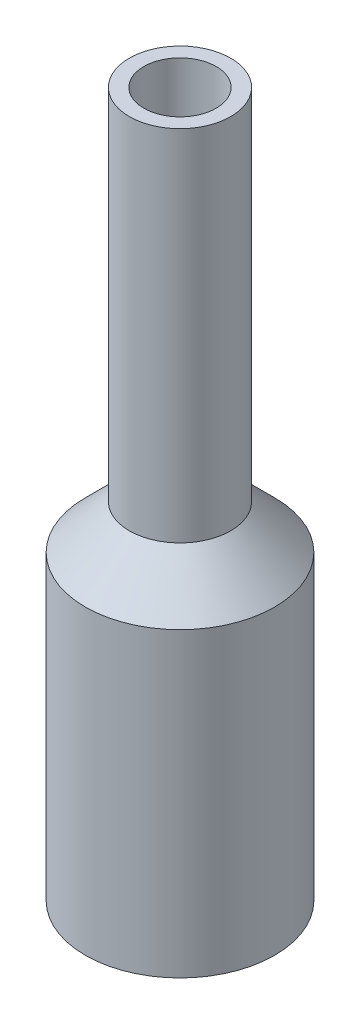
ISO-10303-21;
HEADER;
FILE_DESCRIPTION(('STEP AP214'),'2;1');
FILE_NAME('part.step','',(''),(''),'','','');
FILE_SCHEMA(('AUTOMOTIVE_DESIGN { 1 0 10303 214 1 1 1 1 }'));
ENDSEC;
DATA;
#1=APPLICATION_CONTEXT('core data for automotive mechanical design processes');
#2=APPLICATION_PROTOCOL_DEFINITION('international standard','automotive_design',2000,#1);
#3=PRODUCT_CONTEXT('',#1,'mechanical');
#4=PRODUCT('Part','Part','',(#3));
#5=PRODUCT_RELATED_PRODUCT_CATEGORY('part','',(#4));
#6=PRODUCT_DEFINITION_FORMATION('','',#4);
#7=PRODUCT_DEFINITION_CONTEXT('part definition',#1,'design');
#8=PRODUCT_DEFINITION('design','',#6,#7);
#9=PRODUCT_DEFINITION_SHAPE('','',#8);
#10=(LENGTH_UNIT() NAMED_UNIT(*) SI_UNIT(.MILLI.,.METRE.));
#11=(NAMED_UNIT(*) PLANE_ANGLE_UNIT() SI_UNIT($,.RADIAN.));
#12=(NAMED_UNIT(*) SI_UNIT($,.STERADIAN.) SOLID_ANGLE_UNIT());
#13=UNCERTAINTY_MEASURE_WITH_UNIT(LENGTH_MEASURE(1.E-05),#10,'distance_accuracy_value','');
#14=(GEOMETRIC_REPRESENTATION_CONTEXT(3) GLOBAL_UNCERTAINTY_ASSIGNED_CONTEXT((#13)) GLOBAL_UNIT_ASSIGNED_CONTEXT((#10,
#11,#12)) REPRESENTATION_CONTEXT('',''));
#15=CARTESIAN_POINT('',(0.,0.,0.));
#16=DIRECTION('',(0.,0.,1.));
#17=DIRECTION('',(1.,0.,0.));
#18=AXIS2_PLACEMENT_3D('',#15,#16,#17);
#19=CARTESIAN_POINT('',(0.,2.32867112922393,0.));
#20=DIRECTION('',(0.,-1.,0.));
#21=DIRECTION('',(0.,0.,-1.));
#22=AXIS2_PLACEMENT_3D('',#19,#20,#21);
#23=CONICAL_SURFACE('',#22,1.96196635979795,0.785398163397459);
#24=CARTESIAN_POINT('',(0.,3.24063748902186,0.));
#25=DIRECTION('',(0.,1.,0.));
#26=DIRECTION('',(0.,0.,1.));
#27=AXIS2_PLACEMENT_3D('',#24,#25,#26);
#28=CIRCLE('',#27,1.05);
#29=CARTESIAN_POINT('',(0.,3.24063748902186,1.05));
#30=VERTEX_POINT('',#29);
#31=EDGE_CURVE('E10',#30,#30,#28,.T.);
#32=ORIENTED_EDGE('',*,*,#31,.F.);
#33=EDGE_LOOP('',(#32));
#34=FACE_BOUND('',#33,.T.);
#35=CARTESIAN_POINT('',(0.,2.32867112922393,0.));
#36=DIRECTION('',(0.,1.,0.));
#37=DIRECTION('',(0.,0.,1.));
#38=AXIS2_PLACEMENT_3D('',#35,#36,#37);
#39=CIRCLE('',#38,1.96196635979795);
#40=CARTESIAN_POINT('',(0.,2.32867112922393,1.96196635979795));
#41=VERTEX_POINT('',#40);
#42=EDGE_CURVE('E50',#41,#41,#39,.T.);
#43=ORIENTED_EDGE('',*,*,#42,.T.);
#44=EDGE_LOOP('',(#43));
#45=FACE_BOUND('',#44,.T.);
#46=ADVANCED_FACE('F41',(#34,#45),#23,.T.);
#47=CARTESIAN_POINT('',(0.,19.7590062358836,0.));
#48=DIRECTION('',(0.,1.,0.));
#49=DIRECTION('',(0.,0.,1.));
#50=AXIS2_PLACEMENT_3D('',#47,#48,#49);
#51=CYLINDRICAL_SURFACE('',#50,1.96196635979794);
#52=ORIENTED_EDGE('',*,*,#42,.F.);
#53=EDGE_LOOP('',(#52));
#54=FACE_BOUND('',#53,.T.);
#55=CARTESIAN_POINT('',(0.,-3.9233921878481,0.));
#56=DIRECTION('',(0.,1.,0.));
#57=DIRECTION('',(0.,0.,1.));
#58=AXIS2_PLACEMENT_3D('',#55,#56,#57);
#59=CIRCLE('',#58,1.96196635979794);
#60=CARTESIAN_POINT('',(0.,-3.9233921878481,1.96196635979794));
#61=VERTEX_POINT('',#60);
#62=EDGE_CURVE('E51',#61,#61,#59,.T.);
#63=ORIENTED_EDGE('',*,*,#62,.T.);
#64=EDGE_LOOP('',(#63));
#65=FACE_BOUND('',#64,.T.);
#66=ADVANCED_FACE('F98',(#54,#65),#51,.T.);
#67=CARTESIAN_POINT('',(1.83814693078289,-3.92339218784809,0.));
#68=DIRECTION('',(0.,1.,0.));
#69=DIRECTION('',(0.,0.,1.));
#70=AXIS2_PLACEMENT_3D('',#67,#68,#69);
#71=PLANE('',#70);
#72=ORIENTED_EDGE('',*,*,#62,.F.);
#73=EDGE_LOOP('',(#72));
#74=FACE_BOUND('',#73,.T.);
#75=CARTESIAN_POINT('',(0.,-3.9233921878481,0.));
#76=DIRECTION('',(0.,1.,0.));
#77=DIRECTION('',(0.,0.,1.));
#78=AXIS2_PLACEMENT_3D('',#75,#76,#77);
#79=CIRCLE('',#78,1.83814693078289);
#80=CARTESIAN_POINT('',(0.,-3.9233921878481,1.83814693078289));
#81=VERTEX_POINT('',#80);
#82=EDGE_CURVE('E54',#81,#81,#79,.T.);
#83=ORIENTED_EDGE('',*,*,#82,.T.);
#84=EDGE_LOOP('',(#83));
#85=FACE_BOUND('',#84,.T.);
#86=ADVANCED_FACE('F103',(#74,#85),#71,.F.);
#87=CARTESIAN_POINT('',(0.,19.7590062358836,0.));
#88=DIRECTION('',(0.,1.,0.));
#89=DIRECTION('',(0.,0.,1.));
#90=AXIS2_PLACEMENT_3D('',#87,#88,#89);
#91=CYLINDRICAL_SURFACE('',#90,1.83814693078289);
#92=ORIENTED_EDGE('',*,*,#82,.F.);
#93=EDGE_LOOP('',(#92));
#94=FACE_BOUND('',#93,.T.);
#95=CARTESIAN_POINT('',(0.,2.32867112922393,0.));
#96=DIRECTION('',(0.,1.,0.));
#97=DIRECTION('',(0.,0.,1.));
#98=AXIS2_PLACEMENT_3D('',#95,#96,#97);
#99=CIRCLE('',#98,1.83814693078289);
#100=CARTESIAN_POINT('',(0.,2.32867112922393,1.83814693078289));
#101=VERTEX_POINT('',#100);
#102=EDGE_CURVE('E58',#101,#101,#99,.T.);
#103=ORIENTED_EDGE('',*,*,#102,.T.);
#104=EDGE_LOOP('',(#103));
#105=FACE_BOUND('',#104,.T.);
#106=ADVANCED_FACE('F107',(#94,#105),#91,.F.);
#107=CARTESIAN_POINT('',(0.,2.67660781215191,0.));
#108=DIRECTION('',(0.,-1.,0.));
#109=DIRECTION('',(0.,0.,-1.));
#110=AXIS2_PLACEMENT_3D('',#107,#108,#109);
#111=CONICAL_SURFACE('',#110,0.900000000000001,1.2156456408794);
#112=ORIENTED_EDGE('',*,*,#102,.F.);
#113=EDGE_LOOP('',(#112));
#114=FACE_BOUND('',#113,.T.);
#115=CARTESIAN_POINT('',(0.,2.67660781215191,0.));
#116=DIRECTION('',(0.,1.,0.));
#117=DIRECTION('',(0.,0.,1.));
#118=AXIS2_PLACEMENT_3D('',#115,#116,#117);
#119=CIRCLE('',#118,0.900000000000001);
#120=CARTESIAN_POINT('',(0.,2.67660781215191,0.900000000000001));
#121=VERTEX_POINT('',#120);
#122=EDGE_CURVE('E64',#121,#121,#119,.F.);
#123=ORIENTED_EDGE('',*,*,#122,.F.);
#124=EDGE_LOOP('',(#123));
#125=FACE_BOUND('',#124,.T.);
#126=ADVANCED_FACE('F94',(#114,#125),#111,.F.);
#127=CARTESIAN_POINT('',(0.750000000000001,2.67660781215191,0.));
#128=DIRECTION('',(0.,1.,0.));
#129=DIRECTION('',(0.,0.,1.));
#130=AXIS2_PLACEMENT_3D('',#127,#128,#129);
#131=PLANE('',#130);
#132=CARTESIAN_POINT('',(0.,2.67660781215191,0.));
#133=DIRECTION('',(0.,1.,0.));
#134=DIRECTION('',(0.,0.,1.));
#135=AXIS2_PLACEMENT_3D('',#132,#133,#134);
#136=CIRCLE('',#135,0.750000000000001);
#137=CARTESIAN_POINT('',(0.,2.67660781215191,0.750000000000001));
#138=VERTEX_POINT('',#137);
#139=EDGE_CURVE('E66',#138,#138,#136,.T.);
#140=ORIENTED_EDGE('',*,*,#139,.T.);
#141=EDGE_LOOP('',(#140));
#142=FACE_BOUND('',#141,.T.);
#143=ORIENTED_EDGE('',*,*,#122,.T.);
#144=EDGE_LOOP('',(#143));
#145=FACE_BOUND('',#144,.T.);
#146=ADVANCED_FACE('F88',(#142,#145),#131,.F.);
#147=CARTESIAN_POINT('',(0.,19.7590062358836,0.));
#148=DIRECTION('',(0.,1.,0.));
#149=DIRECTION('',(0.,0.,1.));
#150=AXIS2_PLACEMENT_3D('',#147,#148,#149);
#151=CYLINDRICAL_SURFACE('',#150,1.05);
#152=CARTESIAN_POINT('',(0.,10.6766078121519,0.));
#153=DIRECTION('',(0.,1.,0.));
#154=DIRECTION('',(0.,0.,1.));
#155=AXIS2_PLACEMENT_3D('',#152,#153,#154);
#156=CIRCLE('',#155,1.05);
#157=CARTESIAN_POINT('',(0.,10.6766078121519,1.05));
#158=VERTEX_POINT('',#157);
#159=EDGE_CURVE('E68',#158,#158,#156,.T.);
#160=ORIENTED_EDGE('',*,*,#159,.F.);
#161=EDGE_LOOP('',(#160));
#162=FACE_BOUND('',#161,.T.);
#163=ORIENTED_EDGE('',*,*,#31,.T.);
#164=EDGE_LOOP('',(#163));
#165=FACE_BOUND('',#164,.T.);
#166=ADVANCED_FACE('F83',(#162,#165),#151,.T.);
#167=CARTESIAN_POINT('',(0.,19.7590062358836,0.));
#168=DIRECTION('',(0.,1.,0.));
#169=DIRECTION('',(0.,0.,1.));
#170=AXIS2_PLACEMENT_3D('',#167,#168,#169);
#171=CYLINDRICAL_SURFACE('',#170,0.75);
#172=ORIENTED_EDGE('',*,*,#139,.F.);
#173=EDGE_LOOP('',(#172));
#174=FACE_BOUND('',#173,.T.);
#175=CARTESIAN_POINT('',(0.,10.6766078121519,0.));
#176=DIRECTION('',(0.,1.,0.));
#177=DIRECTION('',(0.,0.,1.));
#178=AXIS2_PLACEMENT_3D('',#175,#176,#177);
#179=CIRCLE('',#178,0.75);
#180=CARTESIAN_POINT('',(0.,10.6766078121519,0.75));
#181=VERTEX_POINT('',#180);
#182=EDGE_CURVE('E75',#181,#181,#179,.T.);
#183=ORIENTED_EDGE('',*,*,#182,.T.);
#184=EDGE_LOOP('',(#183));
#185=FACE_BOUND('',#184,.T.);
#186=ADVANCED_FACE('F77',(#174,#185),#171,.F.);
#187=CARTESIAN_POINT('',(0.75,10.6766078121519,0.));
#188=DIRECTION('',(0.,-1.,0.));
#189=DIRECTION('',(0.,0.,-1.));
#190=AXIS2_PLACEMENT_3D('',#187,#188,#189);
#191=PLANE('',#190);
#192=ORIENTED_EDGE('',*,*,#182,.F.);
#193=EDGE_LOOP('',(#192));
#194=FACE_BOUND('',#193,.T.);
#195=ORIENTED_EDGE('',*,*,#159,.T.);
#196=EDGE_LOOP('',(#195));
#197=FACE_BOUND('',#196,.T.);
#198=ADVANCED_FACE('F79',(#194,#197),#191,.F.);
#199=CLOSED_SHELL('',(#46,#66,#86,#106,#126,#146,#166,#186,#198));
#200=MANIFOLD_SOLID_BREP('B2',#199);
#201=ADVANCED_BREP_SHAPE_REPRESENTATION('',(#18,#200),#14);
#202=SHAPE_DEFINITION_REPRESENTATION(#9,#201);
ENDSEC;
END-ISO-10303-21;
